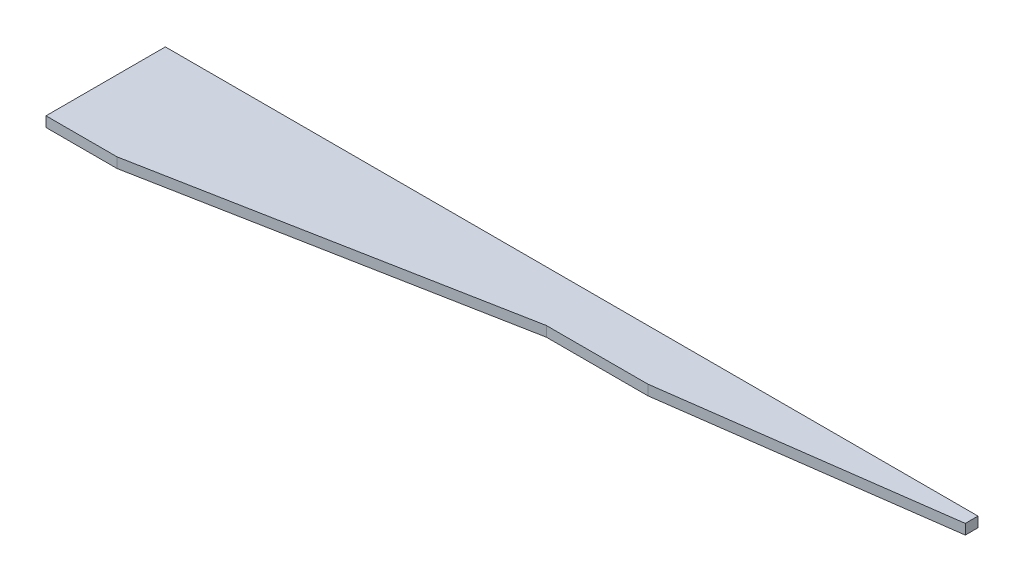
ISO-10303-21;
HEADER;
FILE_DESCRIPTION(('STEP AP214'),'2;1');
FILE_NAME('part.step','',(''),(''),'','','');
FILE_SCHEMA(('AUTOMOTIVE_DESIGN { 1 0 10303 214 1 1 1 1 }'));
ENDSEC;
DATA;
#1=APPLICATION_CONTEXT('core data for automotive mechanical design processes');
#2=APPLICATION_PROTOCOL_DEFINITION('international standard','automotive_design',2000,#1);
#3=PRODUCT_CONTEXT('',#1,'mechanical');
#4=PRODUCT('Part','Part','',(#3));
#5=PRODUCT_RELATED_PRODUCT_CATEGORY('part','',(#4));
#6=PRODUCT_DEFINITION_FORMATION('','',#4);
#7=PRODUCT_DEFINITION_CONTEXT('part definition',#1,'design');
#8=PRODUCT_DEFINITION('design','',#6,#7);
#9=PRODUCT_DEFINITION_SHAPE('','',#8);
#10=(LENGTH_UNIT() NAMED_UNIT(*) SI_UNIT(.MILLI.,.METRE.));
#11=(NAMED_UNIT(*) PLANE_ANGLE_UNIT() SI_UNIT($,.RADIAN.));
#12=(NAMED_UNIT(*) SI_UNIT($,.STERADIAN.) SOLID_ANGLE_UNIT());
#13=UNCERTAINTY_MEASURE_WITH_UNIT(LENGTH_MEASURE(1.E-05),#10,'distance_accuracy_value','');
#14=(GEOMETRIC_REPRESENTATION_CONTEXT(3) GLOBAL_UNCERTAINTY_ASSIGNED_CONTEXT((#13)) GLOBAL_UNIT_ASSIGNED_CONTEXT((#10,
#11,#12)) REPRESENTATION_CONTEXT('',''));
#15=CARTESIAN_POINT('',(0.,0.,0.));
#16=DIRECTION('',(0.,0.,1.));
#17=DIRECTION('',(1.,0.,0.));
#18=AXIS2_PLACEMENT_3D('',#15,#16,#17);
#19=CARTESIAN_POINT('',(320.,4.,0.));
#20=DIRECTION('',(0.,0.,1.));
#21=DIRECTION('',(1.,0.,0.));
#22=AXIS2_PLACEMENT_3D('',#19,#20,#21);
#23=PLANE('',#22);
#24=DIRECTION('',(-1.,0.,0.));
#25=VECTOR('',#24,1.);
#26=CARTESIAN_POINT('',(320.,0.,0.));
#27=LINE('',#26,#25);
#28=CARTESIAN_POINT('',(320.,0.,0.));
#29=VERTEX_POINT('',#28);
#30=CARTESIAN_POINT('',(0.,0.,0.));
#31=VERTEX_POINT('',#30);
#32=EDGE_CURVE('E123',#29,#31,#27,.T.);
#33=ORIENTED_EDGE('',*,*,#32,.T.);
#34=DIRECTION('',(0.,-1.,0.));
#35=VECTOR('',#34,1.);
#36=CARTESIAN_POINT('',(0.,4.,0.));
#37=LINE('',#36,#35);
#38=CARTESIAN_POINT('',(0.,4.,0.));
#39=VERTEX_POINT('',#38);
#40=EDGE_CURVE('E11',#39,#31,#37,.T.);
#41=ORIENTED_EDGE('',*,*,#40,.F.);
#42=DIRECTION('',(-1.,0.,0.));
#43=VECTOR('',#42,1.);
#44=CARTESIAN_POINT('',(320.,4.,0.));
#45=LINE('',#44,#43);
#46=CARTESIAN_POINT('',(320.,4.,0.));
#47=VERTEX_POINT('',#46);
#48=EDGE_CURVE('E135',#47,#39,#45,.T.);
#49=ORIENTED_EDGE('',*,*,#48,.F.);
#50=DIRECTION('',(0.,-1.,0.));
#51=VECTOR('',#50,1.);
#52=CARTESIAN_POINT('',(320.,4.,0.));
#53=LINE('',#52,#51);
#54=EDGE_CURVE('E119',#47,#29,#53,.T.);
#55=ORIENTED_EDGE('',*,*,#54,.T.);
#56=EDGE_LOOP('',(#33,#41,#49,#55));
#57=FACE_BOUND('',#56,.T.);
#58=ADVANCED_FACE('F33',(#57),#23,.F.);
#59=CARTESIAN_POINT('',(0.,4.,0.));
#60=DIRECTION('',(1.,0.,0.));
#61=DIRECTION('',(0.,0.,-1.));
#62=AXIS2_PLACEMENT_3D('',#59,#60,#61);
#63=PLANE('',#62);
#64=DIRECTION('',(0.,0.,1.));
#65=VECTOR('',#64,1.);
#66=CARTESIAN_POINT('',(0.,0.,0.));
#67=LINE('',#66,#65);
#68=CARTESIAN_POINT('',(0.,0.,47.));
#69=VERTEX_POINT('',#68);
#70=EDGE_CURVE('E126',#31,#69,#67,.T.);
#71=ORIENTED_EDGE('',*,*,#70,.T.);
#72=DIRECTION('',(0.,-1.,0.));
#73=VECTOR('',#72,1.);
#74=CARTESIAN_POINT('',(0.,4.,47.));
#75=LINE('',#74,#73);
#76=CARTESIAN_POINT('',(0.,4.,47.));
#77=VERTEX_POINT('',#76);
#78=EDGE_CURVE('E41',#77,#69,#75,.T.);
#79=ORIENTED_EDGE('',*,*,#78,.F.);
#80=DIRECTION('',(0.,0.,1.));
#81=VECTOR('',#80,1.);
#82=CARTESIAN_POINT('',(0.,4.,0.));
#83=LINE('',#82,#81);
#84=EDGE_CURVE('E89',#39,#77,#83,.T.);
#85=ORIENTED_EDGE('',*,*,#84,.F.);
#86=ORIENTED_EDGE('',*,*,#40,.T.);
#87=EDGE_LOOP('',(#71,#79,#85,#86));
#88=FACE_BOUND('',#87,.T.);
#89=ADVANCED_FACE('F160',(#88),#63,.F.);
#90=CARTESIAN_POINT('',(0.,4.,47.));
#91=DIRECTION('',(0.,0.,-1.));
#92=DIRECTION('',(-1.,0.,0.));
#93=AXIS2_PLACEMENT_3D('',#90,#91,#92);
#94=PLANE('',#93);
#95=DIRECTION('',(1.,0.,0.));
#96=VECTOR('',#95,1.);
#97=CARTESIAN_POINT('',(0.,0.,47.));
#98=LINE('',#97,#96);
#99=CARTESIAN_POINT('',(28.,0.,47.));
#100=VERTEX_POINT('',#99);
#101=EDGE_CURVE('E128',#69,#100,#98,.T.);
#102=ORIENTED_EDGE('',*,*,#101,.T.);
#103=DIRECTION('',(0.,-1.,0.));
#104=VECTOR('',#103,1.);
#105=CARTESIAN_POINT('',(28.,4.,47.));
#106=LINE('',#105,#104);
#107=CARTESIAN_POINT('',(28.,4.,47.));
#108=VERTEX_POINT('',#107);
#109=EDGE_CURVE('E139',#108,#100,#106,.T.);
#110=ORIENTED_EDGE('',*,*,#109,.F.);
#111=DIRECTION('',(1.,0.,0.));
#112=VECTOR('',#111,1.);
#113=CARTESIAN_POINT('',(0.,4.,47.));
#114=LINE('',#113,#112);
#115=EDGE_CURVE('E147',#77,#108,#114,.T.);
#116=ORIENTED_EDGE('',*,*,#115,.F.);
#117=ORIENTED_EDGE('',*,*,#78,.T.);
#118=EDGE_LOOP('',(#102,#110,#116,#117));
#119=FACE_BOUND('',#118,.T.);
#120=ADVANCED_FACE('F145',(#119),#94,.F.);
#121=CARTESIAN_POINT('',(170.,4.,20.));
#122=DIRECTION('',(-0.186794189187076,0.,-0.982399069057958));
#123=DIRECTION('',(-0.982399069057958,0.,0.186794189187076));
#124=AXIS2_PLACEMENT_3D('',#121,#122,#123);
#125=PLANE('',#124);
#126=DIRECTION('',(0.982399069057958,0.,-0.186794189187076));
#127=VECTOR('',#126,1.);
#128=CARTESIAN_POINT('',(170.,0.,20.));
#129=LINE('',#128,#127);
#130=CARTESIAN_POINT('',(170.,0.,20.));
#131=VERTEX_POINT('',#130);
#132=EDGE_CURVE('E130',#100,#131,#129,.T.);
#133=ORIENTED_EDGE('',*,*,#132,.T.);
#134=DIRECTION('',(0.,-1.,0.));
#135=VECTOR('',#134,1.);
#136=CARTESIAN_POINT('',(170.,4.,20.));
#137=LINE('',#136,#135);
#138=CARTESIAN_POINT('',(170.,4.,20.));
#139=VERTEX_POINT('',#138);
#140=EDGE_CURVE('E114',#139,#131,#137,.T.);
#141=ORIENTED_EDGE('',*,*,#140,.F.);
#142=DIRECTION('',(0.982399069057958,0.,-0.186794189187076));
#143=VECTOR('',#142,1.);
#144=CARTESIAN_POINT('',(170.,4.,20.));
#145=LINE('',#144,#143);
#146=EDGE_CURVE('E105',#108,#139,#145,.T.);
#147=ORIENTED_EDGE('',*,*,#146,.F.);
#148=ORIENTED_EDGE('',*,*,#109,.T.);
#149=EDGE_LOOP('',(#133,#141,#147,#148));
#150=FACE_BOUND('',#149,.T.);
#151=ADVANCED_FACE('F153',(#150),#125,.F.);
#152=CARTESIAN_POINT('',(170.,4.,20.));
#153=DIRECTION('',(0.,0.,-1.));
#154=DIRECTION('',(-1.,0.,0.));
#155=AXIS2_PLACEMENT_3D('',#152,#153,#154);
#156=PLANE('',#155);
#157=DIRECTION('',(1.,0.,0.));
#158=VECTOR('',#157,1.);
#159=CARTESIAN_POINT('',(170.,0.,20.));
#160=LINE('',#159,#158);
#161=CARTESIAN_POINT('',(210.,0.,20.));
#162=VERTEX_POINT('',#161);
#163=EDGE_CURVE('E113',#131,#162,#160,.T.);
#164=ORIENTED_EDGE('',*,*,#163,.T.);
#165=DIRECTION('',(0.,-1.,0.));
#166=VECTOR('',#165,1.);
#167=CARTESIAN_POINT('',(210.,4.,20.));
#168=LINE('',#167,#166);
#169=CARTESIAN_POINT('',(210.,4.,20.));
#170=VERTEX_POINT('',#169);
#171=EDGE_CURVE('E110',#170,#162,#168,.T.);
#172=ORIENTED_EDGE('',*,*,#171,.F.);
#173=DIRECTION('',(1.,0.,0.));
#174=VECTOR('',#173,1.);
#175=CARTESIAN_POINT('',(170.,4.,20.));
#176=LINE('',#175,#174);
#177=EDGE_CURVE('E99',#139,#170,#176,.T.);
#178=ORIENTED_EDGE('',*,*,#177,.F.);
#179=ORIENTED_EDGE('',*,*,#140,.T.);
#180=EDGE_LOOP('',(#164,#172,#178,#179));
#181=FACE_BOUND('',#180,.T.);
#182=ADVANCED_FACE('F111',(#181),#156,.F.);
#183=CARTESIAN_POINT('',(210.,4.,20.));
#184=DIRECTION('',(-0.135113204733314,0.,-0.990830168044299));
#185=DIRECTION('',(-0.990830168044299,0.,0.135113204733314));
#186=AXIS2_PLACEMENT_3D('',#183,#184,#185);
#187=PLANE('',#186);
#188=DIRECTION('',(0.990830168044299,0.,-0.135113204733314));
#189=VECTOR('',#188,1.);
#190=CARTESIAN_POINT('',(210.,0.,20.));
#191=LINE('',#190,#189);
#192=CARTESIAN_POINT('',(320.,0.,4.99999999999999));
#193=VERTEX_POINT('',#192);
#194=EDGE_CURVE('E75',#162,#193,#191,.T.);
#195=ORIENTED_EDGE('',*,*,#194,.T.);
#196=DIRECTION('',(0.,-1.,0.));
#197=VECTOR('',#196,1.);
#198=CARTESIAN_POINT('',(320.,4.,4.99999999999999));
#199=LINE('',#198,#197);
#200=CARTESIAN_POINT('',(320.,4.,4.99999999999999));
#201=VERTEX_POINT('',#200);
#202=EDGE_CURVE('E115',#201,#193,#199,.T.);
#203=ORIENTED_EDGE('',*,*,#202,.F.);
#204=DIRECTION('',(0.990830168044299,0.,-0.135113204733314));
#205=VECTOR('',#204,1.);
#206=CARTESIAN_POINT('',(210.,4.,20.));
#207=LINE('',#206,#205);
#208=EDGE_CURVE('E103',#170,#201,#207,.T.);
#209=ORIENTED_EDGE('',*,*,#208,.F.);
#210=ORIENTED_EDGE('',*,*,#171,.T.);
#211=EDGE_LOOP('',(#195,#203,#209,#210));
#212=FACE_BOUND('',#211,.T.);
#213=ADVANCED_FACE('F117',(#212),#187,.F.);
#214=CARTESIAN_POINT('',(320.,4.,0.));
#215=DIRECTION('',(-1.,0.,0.));
#216=DIRECTION('',(0.,0.,1.));
#217=AXIS2_PLACEMENT_3D('',#214,#215,#216);
#218=PLANE('',#217);
#219=DIRECTION('',(0.,0.,-1.));
#220=VECTOR('',#219,1.);
#221=CARTESIAN_POINT('',(320.,0.,0.));
#222=LINE('',#221,#220);
#223=EDGE_CURVE('E81',#193,#29,#222,.T.);
#224=ORIENTED_EDGE('',*,*,#223,.T.);
#225=ORIENTED_EDGE('',*,*,#54,.F.);
#226=DIRECTION('',(0.,0.,-1.));
#227=VECTOR('',#226,1.);
#228=CARTESIAN_POINT('',(320.,4.,0.));
#229=LINE('',#228,#227);
#230=EDGE_CURVE('E49',#201,#47,#229,.T.);
#231=ORIENTED_EDGE('',*,*,#230,.F.);
#232=ORIENTED_EDGE('',*,*,#202,.T.);
#233=EDGE_LOOP('',(#224,#225,#231,#232));
#234=FACE_BOUND('',#233,.T.);
#235=ADVANCED_FACE('F174',(#234),#218,.F.);
#236=CARTESIAN_POINT('',(0.,4.,0.));
#237=DIRECTION('',(0.,1.,0.));
#238=DIRECTION('',(0.,0.,1.));
#239=AXIS2_PLACEMENT_3D('',#236,#237,#238);
#240=PLANE('',#239);
#241=ORIENTED_EDGE('',*,*,#48,.T.);
#242=ORIENTED_EDGE('',*,*,#84,.T.);
#243=ORIENTED_EDGE('',*,*,#115,.T.);
#244=ORIENTED_EDGE('',*,*,#146,.T.);
#245=ORIENTED_EDGE('',*,*,#177,.T.);
#246=ORIENTED_EDGE('',*,*,#208,.T.);
#247=ORIENTED_EDGE('',*,*,#230,.T.);
#248=EDGE_LOOP('',(#241,#242,#243,#244,#245,#246,#247));
#249=FACE_BOUND('',#248,.T.);
#250=ADVANCED_FACE('F101',(#249),#240,.T.);
#251=CARTESIAN_POINT('',(0.,0.,0.));
#252=DIRECTION('',(0.,1.,0.));
#253=DIRECTION('',(0.,0.,1.));
#254=AXIS2_PLACEMENT_3D('',#251,#252,#253);
#255=PLANE('',#254);
#256=ORIENTED_EDGE('',*,*,#32,.F.);
#257=ORIENTED_EDGE('',*,*,#223,.F.);
#258=ORIENTED_EDGE('',*,*,#194,.F.);
#259=ORIENTED_EDGE('',*,*,#163,.F.);
#260=ORIENTED_EDGE('',*,*,#132,.F.);
#261=ORIENTED_EDGE('',*,*,#101,.F.);
#262=ORIENTED_EDGE('',*,*,#70,.F.);
#263=EDGE_LOOP('',(#256,#257,#258,#259,#260,#261,#262));
#264=FACE_BOUND('',#263,.T.);
#265=ADVANCED_FACE('F151',(#264),#255,.F.);
#266=CLOSED_SHELL('',(#58,#89,#120,#151,#182,#213,#235,#250,#265));
#267=MANIFOLD_SOLID_BREP('B2',#266);
#268=ADVANCED_BREP_SHAPE_REPRESENTATION('',(#18,#267),#14);
#269=SHAPE_DEFINITION_REPRESENTATION(#9,#268);
ENDSEC;
END-ISO-10303-21;
